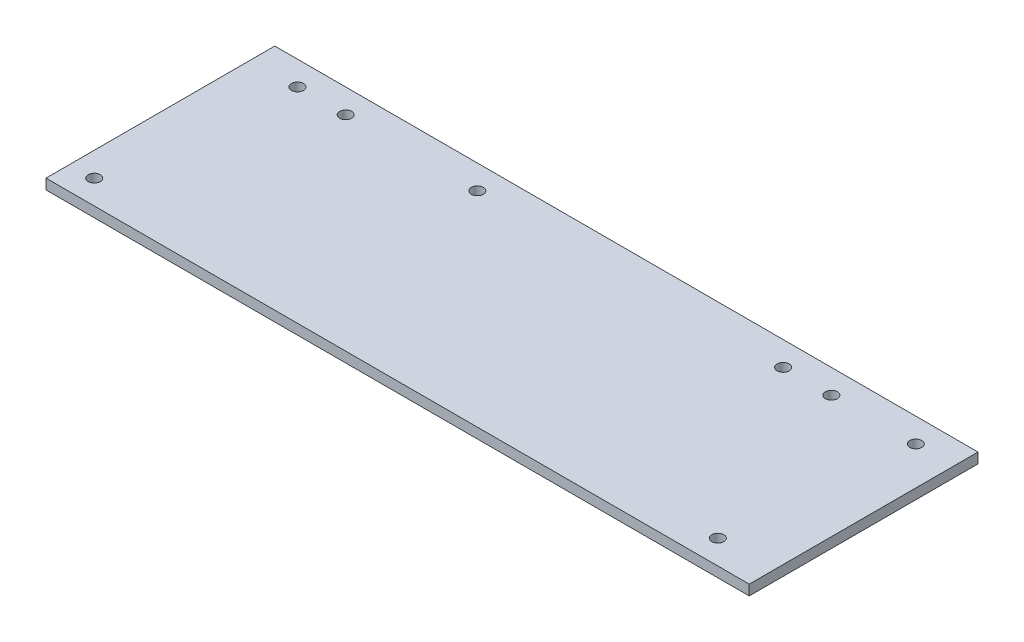
ISO-10303-21;
HEADER;
FILE_DESCRIPTION(('STEP AP214'),'2;1');
FILE_NAME('part.step','',(''),(''),'','','');
FILE_SCHEMA(('AUTOMOTIVE_DESIGN { 1 0 10303 214 1 1 1 1 }'));
ENDSEC;
DATA;
#1=APPLICATION_CONTEXT('core data for automotive mechanical design processes');
#2=APPLICATION_PROTOCOL_DEFINITION('international standard','automotive_design',2000,#1);
#3=PRODUCT_CONTEXT('',#1,'mechanical');
#4=PRODUCT('Part','Part','',(#3));
#5=PRODUCT_RELATED_PRODUCT_CATEGORY('part','',(#4));
#6=PRODUCT_DEFINITION_FORMATION('','',#4);
#7=PRODUCT_DEFINITION_CONTEXT('part definition',#1,'design');
#8=PRODUCT_DEFINITION('design','',#6,#7);
#9=PRODUCT_DEFINITION_SHAPE('','',#8);
#10=(LENGTH_UNIT() NAMED_UNIT(*) SI_UNIT(.MILLI.,.METRE.));
#11=(NAMED_UNIT(*) PLANE_ANGLE_UNIT() SI_UNIT($,.RADIAN.));
#12=(NAMED_UNIT(*) SI_UNIT($,.STERADIAN.) SOLID_ANGLE_UNIT());
#13=UNCERTAINTY_MEASURE_WITH_UNIT(LENGTH_MEASURE(1.E-05),#10,'distance_accuracy_value','');
#14=(GEOMETRIC_REPRESENTATION_CONTEXT(3) GLOBAL_UNCERTAINTY_ASSIGNED_CONTEXT((#13)) GLOBAL_UNIT_ASSIGNED_CONTEXT((#10,
#11,#12)) REPRESENTATION_CONTEXT('',''));
#15=CARTESIAN_POINT('',(0.,0.,0.));
#16=DIRECTION('',(0.,0.,1.));
#17=DIRECTION('',(1.,0.,0.));
#18=AXIS2_PLACEMENT_3D('',#15,#16,#17);
#19=CARTESIAN_POINT('',(-205.867,5.4102,0.));
#20=DIRECTION('',(1.,0.,0.));
#21=DIRECTION('',(0.,0.,-1.));
#22=AXIS2_PLACEMENT_3D('',#19,#20,#21);
#23=PLANE('',#22);
#24=DIRECTION('',(0.,0.,1.));
#25=VECTOR('',#24,1.);
#26=CARTESIAN_POINT('',(-205.867,0.,0.));
#27=LINE('',#26,#25);
#28=CARTESIAN_POINT('',(-205.867,0.,-47.5361));
#29=VERTEX_POINT('',#28);
#30=CARTESIAN_POINT('',(-205.867,0.,72.9361));
#31=VERTEX_POINT('',#30);
#32=EDGE_CURVE('E122',#29,#31,#27,.T.);
#33=ORIENTED_EDGE('',*,*,#32,.T.);
#34=DIRECTION('',(0.,-1.,0.));
#35=VECTOR('',#34,1.);
#36=CARTESIAN_POINT('',(-205.867,5.4102,72.9361));
#37=LINE('',#36,#35);
#38=CARTESIAN_POINT('',(-205.867,5.4102,72.9361));
#39=VERTEX_POINT('',#38);
#40=EDGE_CURVE('E11',#39,#31,#37,.T.);
#41=ORIENTED_EDGE('',*,*,#40,.F.);
#42=DIRECTION('',(0.,0.,1.));
#43=VECTOR('',#42,1.);
#44=CARTESIAN_POINT('',(-205.867,5.4102,0.));
#45=LINE('',#44,#43);
#46=CARTESIAN_POINT('',(-205.867,5.4102,-47.5361));
#47=VERTEX_POINT('',#46);
#48=EDGE_CURVE('E84',#47,#39,#45,.T.);
#49=ORIENTED_EDGE('',*,*,#48,.F.);
#50=DIRECTION('',(0.,-1.,0.));
#51=VECTOR('',#50,1.);
#52=CARTESIAN_POINT('',(-205.867,5.4102,-47.5361));
#53=LINE('',#52,#51);
#54=EDGE_CURVE('E50',#47,#29,#53,.T.);
#55=ORIENTED_EDGE('',*,*,#54,.T.);
#56=EDGE_LOOP('',(#33,#41,#49,#55));
#57=FACE_BOUND('',#56,.T.);
#58=ADVANCED_FACE('F34',(#57),#23,.F.);
#59=CARTESIAN_POINT('',(0.,5.4102,72.9361));
#60=DIRECTION('',(0.,0.,-1.));
#61=DIRECTION('',(-1.,0.,0.));
#62=AXIS2_PLACEMENT_3D('',#59,#60,#61);
#63=PLANE('',#62);
#64=DIRECTION('',(1.,0.,0.));
#65=VECTOR('',#64,1.);
#66=CARTESIAN_POINT('',(0.,0.,72.9361));
#67=LINE('',#66,#65);
#68=CARTESIAN_POINT('',(164.465,0.,72.9361));
#69=VERTEX_POINT('',#68);
#70=EDGE_CURVE('E89',#31,#69,#67,.T.);
#71=ORIENTED_EDGE('',*,*,#70,.T.);
#72=DIRECTION('',(0.,-1.,0.));
#73=VECTOR('',#72,1.);
#74=CARTESIAN_POINT('',(164.465,5.4102,72.9361));
#75=LINE('',#74,#73);
#76=CARTESIAN_POINT('',(164.465,5.4102,72.9361));
#77=VERTEX_POINT('',#76);
#78=EDGE_CURVE('E42',#77,#69,#75,.T.);
#79=ORIENTED_EDGE('',*,*,#78,.F.);
#80=DIRECTION('',(1.,0.,0.));
#81=VECTOR('',#80,1.);
#82=CARTESIAN_POINT('',(0.,5.4102,72.9361));
#83=LINE('',#82,#81);
#84=EDGE_CURVE('E76',#39,#77,#83,.T.);
#85=ORIENTED_EDGE('',*,*,#84,.F.);
#86=ORIENTED_EDGE('',*,*,#40,.T.);
#87=EDGE_LOOP('',(#71,#79,#85,#86));
#88=FACE_BOUND('',#87,.T.);
#89=ADVANCED_FACE('F88',(#88),#63,.F.);
#90=CARTESIAN_POINT('',(164.465,5.4102,0.));
#91=DIRECTION('',(-1.,0.,0.));
#92=DIRECTION('',(0.,0.,1.));
#93=AXIS2_PLACEMENT_3D('',#90,#91,#92);
#94=PLANE('',#93);
#95=DIRECTION('',(0.,0.,-1.));
#96=VECTOR('',#95,1.);
#97=CARTESIAN_POINT('',(164.465,0.,0.));
#98=LINE('',#97,#96);
#99=CARTESIAN_POINT('',(164.465,0.,-47.5361));
#100=VERTEX_POINT('',#99);
#101=EDGE_CURVE('E125',#69,#100,#98,.T.);
#102=ORIENTED_EDGE('',*,*,#101,.T.);
#103=DIRECTION('',(0.,-1.,0.));
#104=VECTOR('',#103,1.);
#105=CARTESIAN_POINT('',(164.465,5.4102,-47.5361));
#106=LINE('',#105,#104);
#107=CARTESIAN_POINT('',(164.465,5.4102,-47.5361));
#108=VERTEX_POINT('',#107);
#109=EDGE_CURVE('E65',#108,#100,#106,.T.);
#110=ORIENTED_EDGE('',*,*,#109,.F.);
#111=DIRECTION('',(0.,0.,-1.));
#112=VECTOR('',#111,1.);
#113=CARTESIAN_POINT('',(164.465,5.4102,0.));
#114=LINE('',#113,#112);
#115=EDGE_CURVE('E83',#77,#108,#114,.T.);
#116=ORIENTED_EDGE('',*,*,#115,.F.);
#117=ORIENTED_EDGE('',*,*,#78,.T.);
#118=EDGE_LOOP('',(#102,#110,#116,#117));
#119=FACE_BOUND('',#118,.T.);
#120=ADVANCED_FACE('F92',(#119),#94,.F.);
#121=CARTESIAN_POINT('',(135.255,5.4102,60.2361));
#122=DIRECTION('',(0.,-1.,0.));
#123=DIRECTION('',(0.,0.,-1.));
#124=AXIS2_PLACEMENT_3D('',#121,#122,#123);
#125=CYLINDRICAL_SURFACE('',#124,3.175);
#126=CARTESIAN_POINT('',(135.255,5.4102,60.2361));
#127=DIRECTION('',(0.,1.,0.));
#128=DIRECTION('',(0.,0.,1.));
#129=AXIS2_PLACEMENT_3D('',#126,#127,#128);
#130=CIRCLE('',#129,3.175);
#131=CARTESIAN_POINT('',(135.255,5.4102,63.4111));
#132=VERTEX_POINT('',#131);
#133=EDGE_CURVE('E116',#132,#132,#130,.T.);
#134=ORIENTED_EDGE('',*,*,#133,.T.);
#135=EDGE_LOOP('',(#134));
#136=FACE_BOUND('',#135,.T.);
#137=CARTESIAN_POINT('',(135.255,0.,60.2361));
#138=DIRECTION('',(0.,1.,0.));
#139=DIRECTION('',(0.,0.,1.));
#140=AXIS2_PLACEMENT_3D('',#137,#138,#139);
#141=CIRCLE('',#140,3.175);
#142=CARTESIAN_POINT('',(135.255,0.,63.4111));
#143=VERTEX_POINT('',#142);
#144=EDGE_CURVE('E148',#143,#143,#141,.T.);
#145=ORIENTED_EDGE('',*,*,#144,.F.);
#146=EDGE_LOOP('',(#145));
#147=FACE_BOUND('',#146,.T.);
#148=ADVANCED_FACE('F194',(#136,#147),#125,.F.);
#149=CARTESIAN_POINT('',(-181.229,5.4102,-34.8361));
#150=DIRECTION('',(0.,-1.,0.));
#151=DIRECTION('',(0.,0.,-1.));
#152=AXIS2_PLACEMENT_3D('',#149,#150,#151);
#153=CYLINDRICAL_SURFACE('',#152,3.175);
#154=CARTESIAN_POINT('',(-181.229,5.4102,-34.8361));
#155=DIRECTION('',(0.,1.,0.));
#156=DIRECTION('',(0.,0.,1.));
#157=AXIS2_PLACEMENT_3D('',#154,#155,#156);
#158=CIRCLE('',#157,3.175);
#159=CARTESIAN_POINT('',(-181.229,5.4102,-31.6611));
#160=VERTEX_POINT('',#159);
#161=EDGE_CURVE('E113',#160,#160,#158,.T.);
#162=ORIENTED_EDGE('',*,*,#161,.T.);
#163=EDGE_LOOP('',(#162));
#164=FACE_BOUND('',#163,.T.);
#165=CARTESIAN_POINT('',(-181.229,0.,-34.8361));
#166=DIRECTION('',(0.,1.,0.));
#167=DIRECTION('',(0.,0.,1.));
#168=AXIS2_PLACEMENT_3D('',#165,#166,#167);
#169=CIRCLE('',#168,3.175);
#170=CARTESIAN_POINT('',(-181.229,0.,-31.6611));
#171=VERTEX_POINT('',#170);
#172=EDGE_CURVE('E145',#171,#171,#169,.T.);
#173=ORIENTED_EDGE('',*,*,#172,.F.);
#174=EDGE_LOOP('',(#173));
#175=FACE_BOUND('',#174,.T.);
#176=ADVANCED_FACE('F196',(#164,#175),#153,.F.);
#177=CARTESIAN_POINT('',(-155.829,5.4102,-34.8361));
#178=DIRECTION('',(0.,-1.,0.));
#179=DIRECTION('',(0.,0.,-1.));
#180=AXIS2_PLACEMENT_3D('',#177,#178,#179);
#181=CYLINDRICAL_SURFACE('',#180,3.175);
#182=CARTESIAN_POINT('',(-155.829,5.4102,-34.8361));
#183=DIRECTION('',(0.,1.,0.));
#184=DIRECTION('',(0.,0.,1.));
#185=AXIS2_PLACEMENT_3D('',#182,#183,#184);
#186=CIRCLE('',#185,3.175);
#187=CARTESIAN_POINT('',(-155.829,5.4102,-31.6611));
#188=VERTEX_POINT('',#187);
#189=EDGE_CURVE('E110',#188,#188,#186,.T.);
#190=ORIENTED_EDGE('',*,*,#189,.T.);
#191=EDGE_LOOP('',(#190));
#192=FACE_BOUND('',#191,.T.);
#193=CARTESIAN_POINT('',(-155.829,0.,-34.8361));
#194=DIRECTION('',(0.,1.,0.));
#195=DIRECTION('',(0.,0.,1.));
#196=AXIS2_PLACEMENT_3D('',#193,#194,#195);
#197=CIRCLE('',#196,3.175);
#198=CARTESIAN_POINT('',(-155.829,0.,-31.6611));
#199=VERTEX_POINT('',#198);
#200=EDGE_CURVE('E142',#199,#199,#197,.T.);
#201=ORIENTED_EDGE('',*,*,#200,.F.);
#202=EDGE_LOOP('',(#201));
#203=FACE_BOUND('',#202,.T.);
#204=ADVANCED_FACE('F202',(#192,#203),#181,.F.);
#205=CARTESIAN_POINT('',(-86.4869999999999,5.4102,-34.8361));
#206=DIRECTION('',(0.,-1.,0.));
#207=DIRECTION('',(0.,0.,-1.));
#208=AXIS2_PLACEMENT_3D('',#205,#206,#207);
#209=CYLINDRICAL_SURFACE('',#208,3.175);
#210=CARTESIAN_POINT('',(-86.4869999999999,5.4102,-34.8361));
#211=DIRECTION('',(0.,1.,0.));
#212=DIRECTION('',(0.,0.,1.));
#213=AXIS2_PLACEMENT_3D('',#210,#211,#212);
#214=CIRCLE('',#213,3.175);
#215=CARTESIAN_POINT('',(-86.4869999999999,5.4102,-31.6611));
#216=VERTEX_POINT('',#215);
#217=EDGE_CURVE('E107',#216,#216,#214,.T.);
#218=ORIENTED_EDGE('',*,*,#217,.T.);
#219=EDGE_LOOP('',(#218));
#220=FACE_BOUND('',#219,.T.);
#221=CARTESIAN_POINT('',(-86.4869999999999,0.,-34.8361));
#222=DIRECTION('',(0.,1.,0.));
#223=DIRECTION('',(0.,0.,1.));
#224=AXIS2_PLACEMENT_3D('',#221,#222,#223);
#225=CIRCLE('',#224,3.175);
#226=CARTESIAN_POINT('',(-86.4869999999999,0.,-31.6611));
#227=VERTEX_POINT('',#226);
#228=EDGE_CURVE('E139',#227,#227,#225,.T.);
#229=ORIENTED_EDGE('',*,*,#228,.F.);
#230=EDGE_LOOP('',(#229));
#231=FACE_BOUND('',#230,.T.);
#232=ADVANCED_FACE('F209',(#220,#231),#209,.F.);
#233=CARTESIAN_POINT('',(99.9490000000001,5.4102,-34.8361));
#234=DIRECTION('',(0.,-1.,0.));
#235=DIRECTION('',(0.,0.,-1.));
#236=AXIS2_PLACEMENT_3D('',#233,#234,#235);
#237=CYLINDRICAL_SURFACE('',#236,3.175);
#238=CARTESIAN_POINT('',(99.9490000000001,5.4102,-34.8361));
#239=DIRECTION('',(0.,1.,0.));
#240=DIRECTION('',(0.,0.,1.));
#241=AXIS2_PLACEMENT_3D('',#238,#239,#240);
#242=CIRCLE('',#241,3.175);
#243=CARTESIAN_POINT('',(99.9490000000001,5.4102,-31.6611));
#244=VERTEX_POINT('',#243);
#245=EDGE_CURVE('E104',#244,#244,#242,.T.);
#246=ORIENTED_EDGE('',*,*,#245,.T.);
#247=EDGE_LOOP('',(#246));
#248=FACE_BOUND('',#247,.T.);
#249=CARTESIAN_POINT('',(99.9490000000001,0.,-34.8361));
#250=DIRECTION('',(0.,1.,0.));
#251=DIRECTION('',(0.,0.,1.));
#252=AXIS2_PLACEMENT_3D('',#249,#250,#251);
#253=CIRCLE('',#252,3.175);
#254=CARTESIAN_POINT('',(99.9490000000001,0.,-31.6611));
#255=VERTEX_POINT('',#254);
#256=EDGE_CURVE('E136',#255,#255,#253,.T.);
#257=ORIENTED_EDGE('',*,*,#256,.F.);
#258=EDGE_LOOP('',(#257));
#259=FACE_BOUND('',#258,.T.);
#260=ADVANCED_FACE('F213',(#248,#259),#237,.F.);
#261=CARTESIAN_POINT('',(144.399,5.4102,-34.8361));
#262=DIRECTION('',(0.,-1.,0.));
#263=DIRECTION('',(0.,0.,-1.));
#264=AXIS2_PLACEMENT_3D('',#261,#262,#263);
#265=CYLINDRICAL_SURFACE('',#264,3.175);
#266=CARTESIAN_POINT('',(144.399,5.4102,-34.8361));
#267=DIRECTION('',(0.,1.,0.));
#268=DIRECTION('',(0.,0.,1.));
#269=AXIS2_PLACEMENT_3D('',#266,#267,#268);
#270=CIRCLE('',#269,3.175);
#271=CARTESIAN_POINT('',(144.399,5.4102,-31.6611));
#272=VERTEX_POINT('',#271);
#273=EDGE_CURVE('E101',#272,#272,#270,.T.);
#274=ORIENTED_EDGE('',*,*,#273,.T.);
#275=EDGE_LOOP('',(#274));
#276=FACE_BOUND('',#275,.T.);
#277=CARTESIAN_POINT('',(144.399,0.,-34.8361));
#278=DIRECTION('',(0.,1.,0.));
#279=DIRECTION('',(0.,0.,1.));
#280=AXIS2_PLACEMENT_3D('',#277,#278,#279);
#281=CIRCLE('',#280,3.175);
#282=CARTESIAN_POINT('',(144.399,0.,-31.6611));
#283=VERTEX_POINT('',#282);
#284=EDGE_CURVE('E133',#283,#283,#281,.T.);
#285=ORIENTED_EDGE('',*,*,#284,.F.);
#286=EDGE_LOOP('',(#285));
#287=FACE_BOUND('',#286,.T.);
#288=ADVANCED_FACE('F217',(#276,#287),#265,.F.);
#289=CARTESIAN_POINT('',(74.5490000000001,5.4102,-34.8360999999999));
#290=DIRECTION('',(0.,-1.,0.));
#291=DIRECTION('',(0.,0.,-1.));
#292=AXIS2_PLACEMENT_3D('',#289,#290,#291);
#293=CYLINDRICAL_SURFACE('',#292,3.175);
#294=CARTESIAN_POINT('',(74.5490000000001,5.4102,-34.8360999999999));
#295=DIRECTION('',(0.,1.,0.));
#296=DIRECTION('',(0.,0.,1.));
#297=AXIS2_PLACEMENT_3D('',#294,#295,#296);
#298=CIRCLE('',#297,3.175);
#299=CARTESIAN_POINT('',(74.5490000000001,5.4102,-31.6610999999999));
#300=VERTEX_POINT('',#299);
#301=EDGE_CURVE('E95',#300,#300,#298,.T.);
#302=ORIENTED_EDGE('',*,*,#301,.T.);
#303=EDGE_LOOP('',(#302));
#304=FACE_BOUND('',#303,.T.);
#305=CARTESIAN_POINT('',(74.5490000000001,0.,-34.8360999999999));
#306=DIRECTION('',(0.,1.,0.));
#307=DIRECTION('',(0.,0.,1.));
#308=AXIS2_PLACEMENT_3D('',#305,#306,#307);
#309=CIRCLE('',#308,3.175);
#310=CARTESIAN_POINT('',(74.5490000000001,0.,-31.6610999999999));
#311=VERTEX_POINT('',#310);
#312=EDGE_CURVE('E130',#311,#311,#309,.T.);
#313=ORIENTED_EDGE('',*,*,#312,.F.);
#314=EDGE_LOOP('',(#313));
#315=FACE_BOUND('',#314,.T.);
#316=ADVANCED_FACE('F169',(#304,#315),#293,.F.);
#317=CARTESIAN_POINT('',(0.,5.4102,-47.5361));
#318=DIRECTION('',(0.,0.,-1.));
#319=DIRECTION('',(-1.,0.,0.));
#320=AXIS2_PLACEMENT_3D('',#317,#318,#319);
#321=PLANE('',#320);
#322=DIRECTION('',(1.,0.,0.));
#323=VECTOR('',#322,1.);
#324=CARTESIAN_POINT('',(0.,0.,-47.5361));
#325=LINE('',#324,#323);
#326=EDGE_CURVE('E127',#29,#100,#325,.T.);
#327=ORIENTED_EDGE('',*,*,#326,.F.);
#328=ORIENTED_EDGE('',*,*,#54,.F.);
#329=DIRECTION('',(1.,0.,0.));
#330=VECTOR('',#329,1.);
#331=CARTESIAN_POINT('',(0.,5.4102,-47.5361));
#332=LINE('',#331,#330);
#333=EDGE_CURVE('E93',#47,#108,#332,.T.);
#334=ORIENTED_EDGE('',*,*,#333,.T.);
#335=ORIENTED_EDGE('',*,*,#109,.T.);
#336=EDGE_LOOP('',(#327,#328,#334,#335));
#337=FACE_BOUND('',#336,.T.);
#338=ADVANCED_FACE('F161',(#337),#321,.T.);
#339=CARTESIAN_POINT('',(-193.167,5.4102,60.2361));
#340=DIRECTION('',(0.,-1.,0.));
#341=DIRECTION('',(0.,0.,-1.));
#342=AXIS2_PLACEMENT_3D('',#339,#340,#341);
#343=CYLINDRICAL_SURFACE('',#342,3.175);
#344=CARTESIAN_POINT('',(-193.167,5.4102,60.2361));
#345=DIRECTION('',(0.,1.,0.));
#346=DIRECTION('',(0.,0.,1.));
#347=AXIS2_PLACEMENT_3D('',#344,#345,#346);
#348=CIRCLE('',#347,3.175);
#349=CARTESIAN_POINT('',(-193.167,5.4102,63.4111));
#350=VERTEX_POINT('',#349);
#351=EDGE_CURVE('E119',#350,#350,#348,.T.);
#352=ORIENTED_EDGE('',*,*,#351,.T.);
#353=EDGE_LOOP('',(#352));
#354=FACE_BOUND('',#353,.T.);
#355=CARTESIAN_POINT('',(-193.167,0.,60.2361));
#356=DIRECTION('',(0.,1.,0.));
#357=DIRECTION('',(0.,0.,1.));
#358=AXIS2_PLACEMENT_3D('',#355,#356,#357);
#359=CIRCLE('',#358,3.175);
#360=CARTESIAN_POINT('',(-193.167,0.,63.4111));
#361=VERTEX_POINT('',#360);
#362=EDGE_CURVE('E151',#361,#361,#359,.T.);
#363=ORIENTED_EDGE('',*,*,#362,.F.);
#364=EDGE_LOOP('',(#363));
#365=FACE_BOUND('',#364,.T.);
#366=ADVANCED_FACE('F159',(#354,#365),#343,.F.);
#367=CARTESIAN_POINT('',(0.,5.4102,0.));
#368=DIRECTION('',(0.,1.,0.));
#369=DIRECTION('',(0.,0.,1.));
#370=AXIS2_PLACEMENT_3D('',#367,#368,#369);
#371=PLANE('',#370);
#372=ORIENTED_EDGE('',*,*,#48,.T.);
#373=ORIENTED_EDGE('',*,*,#84,.T.);
#374=ORIENTED_EDGE('',*,*,#115,.T.);
#375=ORIENTED_EDGE('',*,*,#333,.F.);
#376=EDGE_LOOP('',(#372,#373,#374,#375));
#377=FACE_BOUND('',#376,.T.);
#378=ORIENTED_EDGE('',*,*,#301,.F.);
#379=EDGE_LOOP('',(#378));
#380=FACE_BOUND('',#379,.T.);
#381=ORIENTED_EDGE('',*,*,#273,.F.);
#382=EDGE_LOOP('',(#381));
#383=FACE_BOUND('',#382,.T.);
#384=ORIENTED_EDGE('',*,*,#245,.F.);
#385=EDGE_LOOP('',(#384));
#386=FACE_BOUND('',#385,.T.);
#387=ORIENTED_EDGE('',*,*,#217,.F.);
#388=EDGE_LOOP('',(#387));
#389=FACE_BOUND('',#388,.T.);
#390=ORIENTED_EDGE('',*,*,#189,.F.);
#391=EDGE_LOOP('',(#390));
#392=FACE_BOUND('',#391,.T.);
#393=ORIENTED_EDGE('',*,*,#161,.F.);
#394=EDGE_LOOP('',(#393));
#395=FACE_BOUND('',#394,.T.);
#396=ORIENTED_EDGE('',*,*,#133,.F.);
#397=EDGE_LOOP('',(#396));
#398=FACE_BOUND('',#397,.T.);
#399=ORIENTED_EDGE('',*,*,#351,.F.);
#400=EDGE_LOOP('',(#399));
#401=FACE_BOUND('',#400,.T.);
#402=ADVANCED_FACE('F79',(#377,#380,#383,#386,#389,#392,#395,#398,#401),#371,.T.);
#403=CARTESIAN_POINT('',(0.,0.,0.));
#404=DIRECTION('',(0.,1.,0.));
#405=DIRECTION('',(0.,0.,1.));
#406=AXIS2_PLACEMENT_3D('',#403,#404,#405);
#407=PLANE('',#406);
#408=ORIENTED_EDGE('',*,*,#32,.F.);
#409=ORIENTED_EDGE('',*,*,#326,.T.);
#410=ORIENTED_EDGE('',*,*,#101,.F.);
#411=ORIENTED_EDGE('',*,*,#70,.F.);
#412=EDGE_LOOP('',(#408,#409,#410,#411));
#413=FACE_BOUND('',#412,.T.);
#414=ORIENTED_EDGE('',*,*,#312,.T.);
#415=EDGE_LOOP('',(#414));
#416=FACE_BOUND('',#415,.T.);
#417=ORIENTED_EDGE('',*,*,#284,.T.);
#418=EDGE_LOOP('',(#417));
#419=FACE_BOUND('',#418,.T.);
#420=ORIENTED_EDGE('',*,*,#256,.T.);
#421=EDGE_LOOP('',(#420));
#422=FACE_BOUND('',#421,.T.);
#423=ORIENTED_EDGE('',*,*,#228,.T.);
#424=EDGE_LOOP('',(#423));
#425=FACE_BOUND('',#424,.T.);
#426=ORIENTED_EDGE('',*,*,#200,.T.);
#427=EDGE_LOOP('',(#426));
#428=FACE_BOUND('',#427,.T.);
#429=ORIENTED_EDGE('',*,*,#172,.T.);
#430=EDGE_LOOP('',(#429));
#431=FACE_BOUND('',#430,.T.);
#432=ORIENTED_EDGE('',*,*,#144,.T.);
#433=EDGE_LOOP('',(#432));
#434=FACE_BOUND('',#433,.T.);
#435=ORIENTED_EDGE('',*,*,#362,.T.);
#436=EDGE_LOOP('',(#435));
#437=FACE_BOUND('',#436,.T.);
#438=ADVANCED_FACE('F157',(#413,#416,#419,#422,#425,#428,#431,#434,#437),#407,.F.);
#439=CLOSED_SHELL('',(#58,#89,#120,#148,#176,#204,#232,#260,#288,#316,#338,#366,#402,#438));
#440=MANIFOLD_SOLID_BREP('B2',#439);
#441=ADVANCED_BREP_SHAPE_REPRESENTATION('',(#18,#440),#14);
#442=SHAPE_DEFINITION_REPRESENTATION(#9,#441);
ENDSEC;
END-ISO-10303-21;
